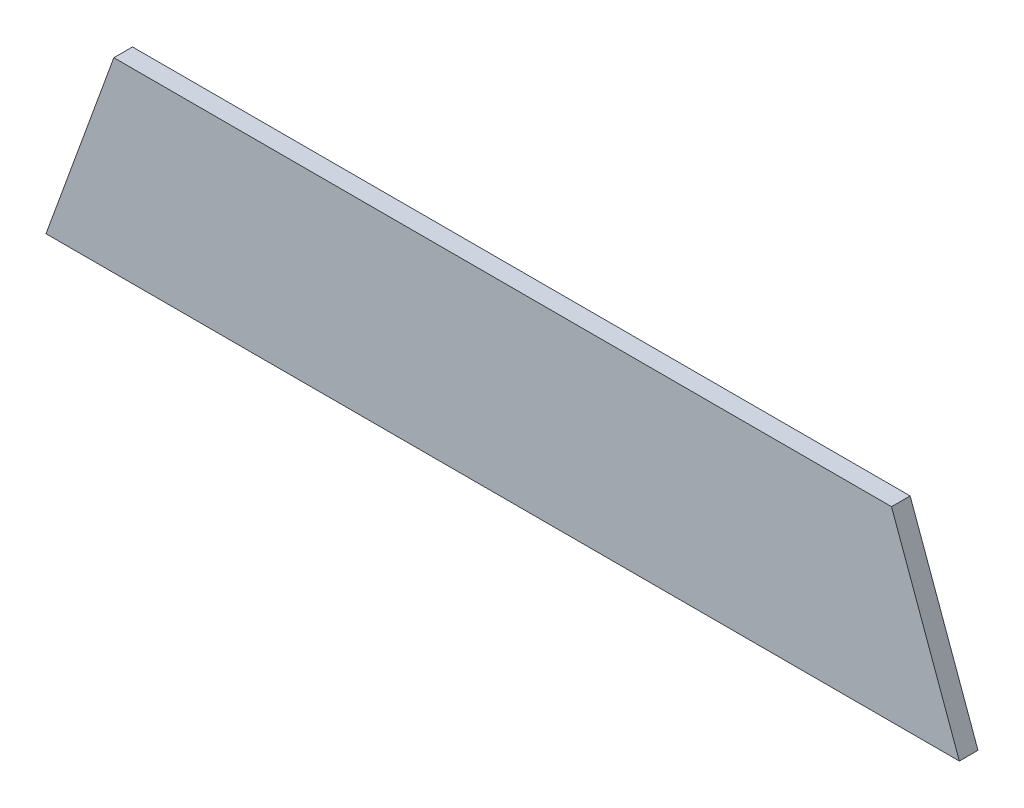
ISO-10303-21;
HEADER;
FILE_DESCRIPTION(('STEP AP214'),'2;1');
FILE_NAME('part.step','',(''),(''),'','','');
FILE_SCHEMA(('AUTOMOTIVE_DESIGN { 1 0 10303 214 1 1 1 1 }'));
ENDSEC;
DATA;
#1=APPLICATION_CONTEXT('core data for automotive mechanical design processes');
#2=APPLICATION_PROTOCOL_DEFINITION('international standard','automotive_design',2000,#1);
#3=PRODUCT_CONTEXT('',#1,'mechanical');
#4=PRODUCT('Part','Part','',(#3));
#5=PRODUCT_RELATED_PRODUCT_CATEGORY('part','',(#4));
#6=PRODUCT_DEFINITION_FORMATION('','',#4);
#7=PRODUCT_DEFINITION_CONTEXT('part definition',#1,'design');
#8=PRODUCT_DEFINITION('design','',#6,#7);
#9=PRODUCT_DEFINITION_SHAPE('','',#8);
#10=(LENGTH_UNIT() NAMED_UNIT(*) SI_UNIT(.MILLI.,.METRE.));
#11=(NAMED_UNIT(*) PLANE_ANGLE_UNIT() SI_UNIT($,.RADIAN.));
#12=(NAMED_UNIT(*) SI_UNIT($,.STERADIAN.) SOLID_ANGLE_UNIT());
#13=UNCERTAINTY_MEASURE_WITH_UNIT(LENGTH_MEASURE(1.E-05),#10,'distance_accuracy_value','');
#14=(GEOMETRIC_REPRESENTATION_CONTEXT(3) GLOBAL_UNCERTAINTY_ASSIGNED_CONTEXT((#13)) GLOBAL_UNIT_ASSIGNED_CONTEXT((#10,
#11,#12)) REPRESENTATION_CONTEXT('',''));
#15=CARTESIAN_POINT('',(0.,0.,0.));
#16=DIRECTION('',(0.,0.,1.));
#17=DIRECTION('',(1.,0.,0.));
#18=AXIS2_PLACEMENT_3D('',#15,#16,#17);
#19=CARTESIAN_POINT('',(48.72,-10.,2.));
#20=DIRECTION('',(-0.93969262078591,-0.342020143325665,0.));
#21=DIRECTION('',(0.342020143325665,-0.93969262078591,0.));
#22=AXIS2_PLACEMENT_3D('',#19,#20,#21);
#23=PLANE('',#22);
#24=DIRECTION('',(-0.342020143325665,0.93969262078591,0.));
#25=VECTOR('',#24,1.);
#26=CARTESIAN_POINT('',(48.72,-10.,0.));
#27=LINE('',#26,#25);
#28=CARTESIAN_POINT('',(48.72,-10.,0.));
#29=VERTEX_POINT('',#28);
#30=CARTESIAN_POINT('',(41.440595314676,10.,0.));
#31=VERTEX_POINT('',#30);
#32=EDGE_CURVE('E98',#29,#31,#27,.T.);
#33=ORIENTED_EDGE('',*,*,#32,.T.);
#34=DIRECTION('',(0.,0.,-1.));
#35=VECTOR('',#34,1.);
#36=CARTESIAN_POINT('',(41.440595314676,10.,2.));
#37=LINE('',#36,#35);
#38=CARTESIAN_POINT('',(41.440595314676,10.,2.));
#39=VERTEX_POINT('',#38);
#40=EDGE_CURVE('E11',#39,#31,#37,.T.);
#41=ORIENTED_EDGE('',*,*,#40,.F.);
#42=DIRECTION('',(-0.342020143325665,0.93969262078591,0.));
#43=VECTOR('',#42,1.);
#44=CARTESIAN_POINT('',(48.72,-10.,2.));
#45=LINE('',#44,#43);
#46=CARTESIAN_POINT('',(48.72,-10.,2.));
#47=VERTEX_POINT('',#46);
#48=EDGE_CURVE('E86',#47,#39,#45,.T.);
#49=ORIENTED_EDGE('',*,*,#48,.F.);
#50=DIRECTION('',(0.,0.,-1.));
#51=VECTOR('',#50,1.);
#52=CARTESIAN_POINT('',(48.72,-10.,2.));
#53=LINE('',#52,#51);
#54=EDGE_CURVE('E94',#47,#29,#53,.T.);
#55=ORIENTED_EDGE('',*,*,#54,.T.);
#56=EDGE_LOOP('',(#33,#41,#49,#55));
#57=FACE_BOUND('',#56,.T.);
#58=ADVANCED_FACE('F35',(#57),#23,.F.);
#59=CARTESIAN_POINT('',(-42.000595314676,10.,2.));
#60=DIRECTION('',(0.,-1.,0.));
#61=DIRECTION('',(0.,0.,-1.));
#62=AXIS2_PLACEMENT_3D('',#59,#60,#61);
#63=PLANE('',#62);
#64=DIRECTION('',(-1.,0.,0.));
#65=VECTOR('',#64,1.);
#66=CARTESIAN_POINT('',(-42.000595314676,10.,0.));
#67=LINE('',#66,#65);
#68=CARTESIAN_POINT('',(-42.000595314676,10.,0.));
#69=VERTEX_POINT('',#68);
#70=EDGE_CURVE('E90',#31,#69,#67,.T.);
#71=ORIENTED_EDGE('',*,*,#70,.T.);
#72=DIRECTION('',(0.,0.,-1.));
#73=VECTOR('',#72,1.);
#74=CARTESIAN_POINT('',(-42.000595314676,10.,2.));
#75=LINE('',#74,#73);
#76=CARTESIAN_POINT('',(-42.000595314676,10.,2.));
#77=VERTEX_POINT('',#76);
#78=EDGE_CURVE('E43',#77,#69,#75,.T.);
#79=ORIENTED_EDGE('',*,*,#78,.F.);
#80=DIRECTION('',(-1.,0.,0.));
#81=VECTOR('',#80,1.);
#82=CARTESIAN_POINT('',(-42.000595314676,10.,2.));
#83=LINE('',#82,#81);
#84=EDGE_CURVE('E81',#39,#77,#83,.T.);
#85=ORIENTED_EDGE('',*,*,#84,.F.);
#86=ORIENTED_EDGE('',*,*,#40,.T.);
#87=EDGE_LOOP('',(#71,#79,#85,#86));
#88=FACE_BOUND('',#87,.T.);
#89=ADVANCED_FACE('F89',(#88),#63,.F.);
#90=CARTESIAN_POINT('',(-49.28,-10.,2.));
#91=DIRECTION('',(0.93969262078591,-0.342020143325665,0.));
#92=DIRECTION('',(0.342020143325665,0.93969262078591,0.));
#93=AXIS2_PLACEMENT_3D('',#90,#91,#92);
#94=PLANE('',#93);
#95=DIRECTION('',(-0.342020143325665,-0.93969262078591,0.));
#96=VECTOR('',#95,1.);
#97=CARTESIAN_POINT('',(-49.28,-10.,0.));
#98=LINE('',#97,#96);
#99=CARTESIAN_POINT('',(-49.28,-10.,0.));
#100=VERTEX_POINT('',#99);
#101=EDGE_CURVE('E68',#69,#100,#98,.T.);
#102=ORIENTED_EDGE('',*,*,#101,.T.);
#103=DIRECTION('',(0.,0.,-1.));
#104=VECTOR('',#103,1.);
#105=CARTESIAN_POINT('',(-49.28,-10.,2.));
#106=LINE('',#105,#104);
#107=CARTESIAN_POINT('',(-49.28,-10.,2.));
#108=VERTEX_POINT('',#107);
#109=EDGE_CURVE('E91',#108,#100,#106,.T.);
#110=ORIENTED_EDGE('',*,*,#109,.F.);
#111=DIRECTION('',(-0.342020143325665,-0.93969262078591,0.));
#112=VECTOR('',#111,1.);
#113=CARTESIAN_POINT('',(-49.28,-10.,2.));
#114=LINE('',#113,#112);
#115=EDGE_CURVE('E84',#77,#108,#114,.T.);
#116=ORIENTED_EDGE('',*,*,#115,.F.);
#117=ORIENTED_EDGE('',*,*,#78,.T.);
#118=EDGE_LOOP('',(#102,#110,#116,#117));
#119=FACE_BOUND('',#118,.T.);
#120=ADVANCED_FACE('F92',(#119),#94,.F.);
#121=CARTESIAN_POINT('',(-49.28,-10.,2.));
#122=DIRECTION('',(0.,1.,0.));
#123=DIRECTION('',(-1.,0.,0.));
#124=AXIS2_PLACEMENT_3D('',#121,#122,#123);
#125=PLANE('',#124);
#126=DIRECTION('',(1.,0.,0.));
#127=VECTOR('',#126,1.);
#128=CARTESIAN_POINT('',(-49.28,-10.,0.));
#129=LINE('',#128,#127);
#130=EDGE_CURVE('E74',#100,#29,#129,.T.);
#131=ORIENTED_EDGE('',*,*,#130,.T.);
#132=ORIENTED_EDGE('',*,*,#54,.F.);
#133=DIRECTION('',(1.,0.,0.));
#134=VECTOR('',#133,1.);
#135=CARTESIAN_POINT('',(-49.28,-10.,2.));
#136=LINE('',#135,#134);
#137=EDGE_CURVE('E51',#108,#47,#136,.T.);
#138=ORIENTED_EDGE('',*,*,#137,.F.);
#139=ORIENTED_EDGE('',*,*,#109,.T.);
#140=EDGE_LOOP('',(#131,#132,#138,#139));
#141=FACE_BOUND('',#140,.T.);
#142=ADVANCED_FACE('F105',(#141),#125,.F.);
#143=CARTESIAN_POINT('',(0.,0.,2.));
#144=DIRECTION('',(0.,0.,-1.));
#145=DIRECTION('',(-1.,0.,0.));
#146=AXIS2_PLACEMENT_3D('',#143,#144,#145);
#147=PLANE('',#146);
#148=ORIENTED_EDGE('',*,*,#48,.T.);
#149=ORIENTED_EDGE('',*,*,#84,.T.);
#150=ORIENTED_EDGE('',*,*,#115,.T.);
#151=ORIENTED_EDGE('',*,*,#137,.T.);
#152=EDGE_LOOP('',(#148,#149,#150,#151));
#153=FACE_BOUND('',#152,.T.);
#154=ADVANCED_FACE('F82',(#153),#147,.F.);
#155=CARTESIAN_POINT('',(0.,0.,0.));
#156=DIRECTION('',(0.,0.,-1.));
#157=DIRECTION('',(-1.,0.,0.));
#158=AXIS2_PLACEMENT_3D('',#155,#156,#157);
#159=PLANE('',#158);
#160=ORIENTED_EDGE('',*,*,#32,.F.);
#161=ORIENTED_EDGE('',*,*,#130,.F.);
#162=ORIENTED_EDGE('',*,*,#101,.F.);
#163=ORIENTED_EDGE('',*,*,#70,.F.);
#164=EDGE_LOOP('',(#160,#161,#162,#163));
#165=FACE_BOUND('',#164,.T.);
#166=ADVANCED_FACE('F108',(#165),#159,.T.);
#167=CLOSED_SHELL('',(#58,#89,#120,#142,#154,#166));
#168=MANIFOLD_SOLID_BREP('B2',#167);
#169=ADVANCED_BREP_SHAPE_REPRESENTATION('',(#18,#168),#14);
#170=SHAPE_DEFINITION_REPRESENTATION(#9,#169);
ENDSEC;
END-ISO-10303-21;
